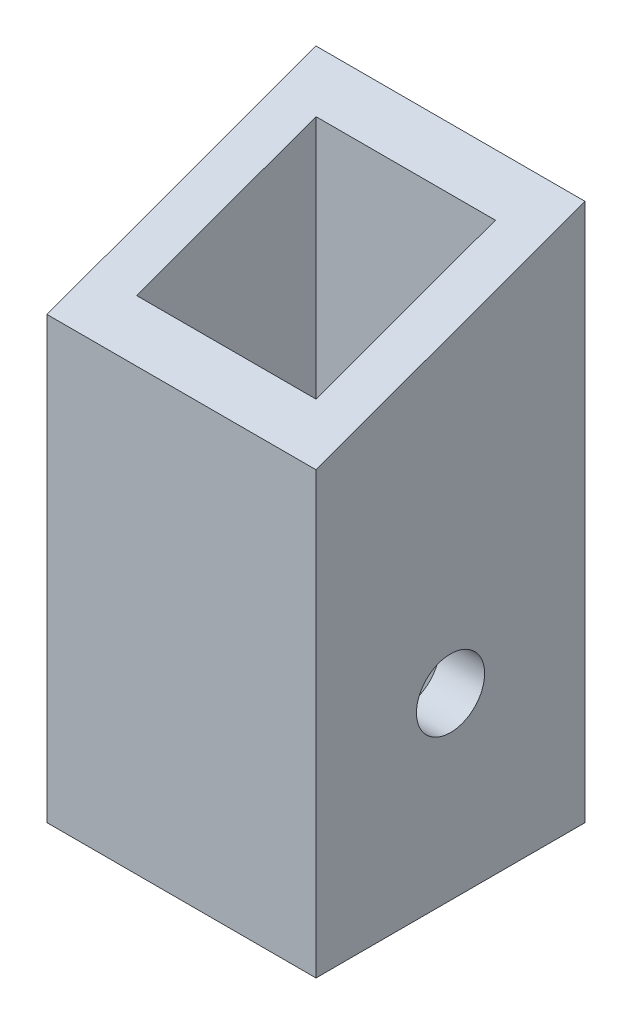
ISO-10303-21;
HEADER;
FILE_DESCRIPTION(('STEP AP214'),'2;1');
FILE_NAME('part.step','',(''),(''),'','','');
FILE_SCHEMA(('AUTOMOTIVE_DESIGN { 1 0 10303 214 1 1 1 1 }'));
ENDSEC;
DATA;
#1=APPLICATION_CONTEXT('core data for automotive mechanical design processes');
#2=APPLICATION_PROTOCOL_DEFINITION('international standard','automotive_design',2000,#1);
#3=PRODUCT_CONTEXT('',#1,'mechanical');
#4=PRODUCT('Part','Part','',(#3));
#5=PRODUCT_RELATED_PRODUCT_CATEGORY('part','',(#4));
#6=PRODUCT_DEFINITION_FORMATION('','',#4);
#7=PRODUCT_DEFINITION_CONTEXT('part definition',#1,'design');
#8=PRODUCT_DEFINITION('design','',#6,#7);
#9=PRODUCT_DEFINITION_SHAPE('','',#8);
#10=(LENGTH_UNIT() NAMED_UNIT(*) SI_UNIT(.MILLI.,.METRE.));
#11=(NAMED_UNIT(*) PLANE_ANGLE_UNIT() SI_UNIT($,.RADIAN.));
#12=(NAMED_UNIT(*) SI_UNIT($,.STERADIAN.) SOLID_ANGLE_UNIT());
#13=UNCERTAINTY_MEASURE_WITH_UNIT(LENGTH_MEASURE(1.E-05),#10,'distance_accuracy_value','');
#14=(GEOMETRIC_REPRESENTATION_CONTEXT(3) GLOBAL_UNCERTAINTY_ASSIGNED_CONTEXT((#13)) GLOBAL_UNIT_ASSIGNED_CONTEXT((#10,
#11,#12)) REPRESENTATION_CONTEXT('',''));
#15=CARTESIAN_POINT('',(0.,0.,0.));
#16=DIRECTION('',(0.,0.,1.));
#17=DIRECTION('',(1.,0.,0.));
#18=AXIS2_PLACEMENT_3D('',#15,#16,#17);
#19=CARTESIAN_POINT('',(19.05,-198.741450370207,-249.444858146427));
#20=DIRECTION('',(0.,-0.93969262078591,-0.342020143325665));
#21=DIRECTION('',(0.,0.342020143325665,-0.93969262078591));
#22=AXIS2_PLACEMENT_3D('',#19,#20,#21);
#23=PLANE('',#22);
#24=DIRECTION('',(1.,0.,0.));
#25=VECTOR('',#24,1.);
#26=CARTESIAN_POINT('',(19.05,-192.963422901231,-265.319858146427));
#27=LINE('',#26,#25);
#28=CARTESIAN_POINT('',(3.175,-192.963422901231,-265.319858146427));
#29=VERTEX_POINT('',#28);
#30=CARTESIAN_POINT('',(15.875,-192.963422901231,-265.319858146427));
#31=VERTEX_POINT('',#30);
#32=EDGE_CURVE('E129',#29,#31,#27,.T.);
#33=ORIENTED_EDGE('',*,*,#32,.T.);
#34=DIRECTION('',(0.,-0.342020143325665,0.93969262078591));
#35=VECTOR('',#34,1.);
#36=CARTESIAN_POINT('',(15.875,-198.741450370207,-249.444858146427));
#37=LINE('',#36,#35);
#38=CARTESIAN_POINT('',(15.875,-197.585844876412,-252.619858146427));
#39=VERTEX_POINT('',#38);
#40=EDGE_CURVE('E132',#31,#39,#37,.T.);
#41=ORIENTED_EDGE('',*,*,#40,.T.);
#42=DIRECTION('',(-1.,0.,0.));
#43=VECTOR('',#42,1.);
#44=CARTESIAN_POINT('',(19.05,-197.585844876412,-252.619858146427));
#45=LINE('',#44,#43);
#46=CARTESIAN_POINT('',(3.175,-197.585844876412,-252.619858146427));
#47=VERTEX_POINT('',#46);
#48=EDGE_CURVE('E124',#39,#47,#45,.T.);
#49=ORIENTED_EDGE('',*,*,#48,.T.);
#50=DIRECTION('',(0.,0.342020143325665,-0.93969262078591));
#51=VECTOR('',#50,1.);
#52=CARTESIAN_POINT('',(3.175,-198.741450370207,-249.444858146427));
#53=LINE('',#52,#51);
#54=EDGE_CURVE('E104',#47,#29,#53,.T.);
#55=ORIENTED_EDGE('',*,*,#54,.T.);
#56=EDGE_LOOP('',(#33,#41,#49,#55));
#57=FACE_BOUND('',#56,.T.);
#58=DIRECTION('',(0.,-0.342020143325665,0.93969262078591));
#59=VECTOR('',#58,1.);
#60=CARTESIAN_POINT('',(0.,-198.741450370207,-249.444858146427));
#61=LINE('',#60,#59);
#62=CARTESIAN_POINT('',(0.,-191.807817407436,-268.494858146427));
#63=VERTEX_POINT('',#62);
#64=CARTESIAN_POINT('',(0.,-198.741450370207,-249.444858146427));
#65=VERTEX_POINT('',#64);
#66=EDGE_CURVE('E135',#63,#65,#61,.T.);
#67=ORIENTED_EDGE('',*,*,#66,.T.);
#68=DIRECTION('',(-1.,0.,0.));
#69=VECTOR('',#68,1.);
#70=CARTESIAN_POINT('',(19.05,-198.741450370207,-249.444858146427));
#71=LINE('',#70,#69);
#72=CARTESIAN_POINT('',(19.05,-198.741450370207,-249.444858146427));
#73=VERTEX_POINT('',#72);
#74=EDGE_CURVE('E11',#73,#65,#71,.T.);
#75=ORIENTED_EDGE('',*,*,#74,.F.);
#76=DIRECTION('',(0.,-0.342020143325665,0.93969262078591));
#77=VECTOR('',#76,1.);
#78=CARTESIAN_POINT('',(19.05,-198.741450370207,-249.444858146427));
#79=LINE('',#78,#77);
#80=CARTESIAN_POINT('',(19.05,-191.807817407436,-268.494858146427));
#81=VERTEX_POINT('',#80);
#82=EDGE_CURVE('E136',#81,#73,#79,.T.);
#83=ORIENTED_EDGE('',*,*,#82,.F.);
#84=DIRECTION('',(-1.,0.,0.));
#85=VECTOR('',#84,1.);
#86=CARTESIAN_POINT('',(19.05,-191.807817407436,-268.494858146427));
#87=LINE('',#86,#85);
#88=EDGE_CURVE('E146',#81,#63,#87,.T.);
#89=ORIENTED_EDGE('',*,*,#88,.T.);
#90=EDGE_LOOP('',(#67,#75,#83,#89));
#91=FACE_BOUND('',#90,.T.);
#92=ADVANCED_FACE('F33',(#57,#91),#23,.F.);
#93=CARTESIAN_POINT('',(19.05,-229.907817407436,-249.444858146427));
#94=DIRECTION('',(0.,0.,-1.));
#95=DIRECTION('',(-1.,0.,0.));
#96=AXIS2_PLACEMENT_3D('',#93,#94,#95);
#97=PLANE('',#96);
#98=DIRECTION('',(0.,-1.,0.));
#99=VECTOR('',#98,1.);
#100=CARTESIAN_POINT('',(0.,-229.907817407436,-249.444858146427));
#101=LINE('',#100,#99);
#102=CARTESIAN_POINT('',(0.,-229.907817407436,-249.444858146427));
#103=VERTEX_POINT('',#102);
#104=EDGE_CURVE('E149',#65,#103,#101,.T.);
#105=ORIENTED_EDGE('',*,*,#104,.T.);
#106=DIRECTION('',(-1.,0.,0.));
#107=VECTOR('',#106,1.);
#108=CARTESIAN_POINT('',(19.05,-229.907817407436,-249.444858146427));
#109=LINE('',#108,#107);
#110=CARTESIAN_POINT('',(19.05,-229.907817407436,-249.444858146427));
#111=VERTEX_POINT('',#110);
#112=EDGE_CURVE('E41',#111,#103,#109,.T.);
#113=ORIENTED_EDGE('',*,*,#112,.F.);
#114=DIRECTION('',(0.,-1.,0.));
#115=VECTOR('',#114,1.);
#116=CARTESIAN_POINT('',(19.05,-229.907817407436,-249.444858146427));
#117=LINE('',#116,#115);
#118=EDGE_CURVE('E139',#73,#111,#117,.T.);
#119=ORIENTED_EDGE('',*,*,#118,.F.);
#120=ORIENTED_EDGE('',*,*,#74,.T.);
#121=EDGE_LOOP('',(#105,#113,#119,#120));
#122=FACE_BOUND('',#121,.T.);
#123=ADVANCED_FACE('F178',(#122),#97,.F.);
#124=CARTESIAN_POINT('',(19.05,-229.907817407436,-268.494858146427));
#125=DIRECTION('',(0.,1.,0.));
#126=DIRECTION('',(0.,0.,1.));
#127=AXIS2_PLACEMENT_3D('',#124,#125,#126);
#128=PLANE('',#127);
#129=DIRECTION('',(-1.,0.,0.));
#130=VECTOR('',#129,1.);
#131=CARTESIAN_POINT('',(3.175,-229.907817407435,-252.619858146427));
#132=LINE('',#131,#130);
#133=CARTESIAN_POINT('',(15.875,-229.907817407436,-252.619858146427));
#134=VERTEX_POINT('',#133);
#135=CARTESIAN_POINT('',(3.175,-229.907817407435,-252.619858146427));
#136=VERTEX_POINT('',#135);
#137=EDGE_CURVE('E110',#134,#136,#132,.T.);
#138=ORIENTED_EDGE('',*,*,#137,.F.);
#139=DIRECTION('',(0.,0.,1.));
#140=VECTOR('',#139,1.);
#141=CARTESIAN_POINT('',(15.875,-229.907817407435,-252.619858146427));
#142=LINE('',#141,#140);
#143=CARTESIAN_POINT('',(15.875,-229.907817407435,-265.319858146427));
#144=VERTEX_POINT('',#143);
#145=EDGE_CURVE('E56',#144,#134,#142,.T.);
#146=ORIENTED_EDGE('',*,*,#145,.F.);
#147=DIRECTION('',(1.,0.,0.));
#148=VECTOR('',#147,1.);
#149=CARTESIAN_POINT('',(3.175,-229.907817407435,-265.319858146427));
#150=LINE('',#149,#148);
#151=CARTESIAN_POINT('',(3.175,-229.907817407435,-265.319858146427));
#152=VERTEX_POINT('',#151);
#153=EDGE_CURVE('E117',#152,#144,#150,.T.);
#154=ORIENTED_EDGE('',*,*,#153,.F.);
#155=DIRECTION('',(0.,0.,-1.));
#156=VECTOR('',#155,1.);
#157=CARTESIAN_POINT('',(3.175,-229.907817407435,-252.619858146427));
#158=LINE('',#157,#156);
#159=EDGE_CURVE('E101',#136,#152,#158,.T.);
#160=ORIENTED_EDGE('',*,*,#159,.F.);
#161=EDGE_LOOP('',(#138,#146,#154,#160));
#162=FACE_BOUND('',#161,.T.);
#163=DIRECTION('',(0.,0.,-1.));
#164=VECTOR('',#163,1.);
#165=CARTESIAN_POINT('',(0.,-229.907817407436,-268.494858146427));
#166=LINE('',#165,#164);
#167=CARTESIAN_POINT('',(0.,-229.907817407436,-268.494858146427));
#168=VERTEX_POINT('',#167);
#169=EDGE_CURVE('E151',#103,#168,#166,.T.);
#170=ORIENTED_EDGE('',*,*,#169,.T.);
#171=DIRECTION('',(-1.,0.,0.));
#172=VECTOR('',#171,1.);
#173=CARTESIAN_POINT('',(19.05,-229.907817407436,-268.494858146427));
#174=LINE('',#173,#172);
#175=CARTESIAN_POINT('',(19.05,-229.907817407436,-268.494858146427));
#176=VERTEX_POINT('',#175);
#177=EDGE_CURVE('E156',#176,#168,#174,.T.);
#178=ORIENTED_EDGE('',*,*,#177,.F.);
#179=DIRECTION('',(0.,0.,-1.));
#180=VECTOR('',#179,1.);
#181=CARTESIAN_POINT('',(19.05,-229.907817407436,-268.494858146427));
#182=LINE('',#181,#180);
#183=EDGE_CURVE('E142',#111,#176,#182,.T.);
#184=ORIENTED_EDGE('',*,*,#183,.F.);
#185=ORIENTED_EDGE('',*,*,#112,.T.);
#186=EDGE_LOOP('',(#170,#178,#184,#185));
#187=FACE_BOUND('',#186,.T.);
#188=ADVANCED_FACE('F114',(#162,#187),#128,.F.);
#189=CARTESIAN_POINT('',(19.05,-191.807817407436,-268.494858146427));
#190=DIRECTION('',(0.,0.,1.));
#191=DIRECTION('',(1.,0.,0.));
#192=AXIS2_PLACEMENT_3D('',#189,#190,#191);
#193=PLANE('',#192);
#194=DIRECTION('',(0.,1.,0.));
#195=VECTOR('',#194,1.);
#196=CARTESIAN_POINT('',(0.,-191.807817407436,-268.494858146427));
#197=LINE('',#196,#195);
#198=EDGE_CURVE('E140',#168,#63,#197,.T.);
#199=ORIENTED_EDGE('',*,*,#198,.T.);
#200=ORIENTED_EDGE('',*,*,#88,.F.);
#201=DIRECTION('',(0.,1.,0.));
#202=VECTOR('',#201,1.);
#203=CARTESIAN_POINT('',(19.05,-191.807817407436,-268.494858146427));
#204=LINE('',#203,#202);
#205=EDGE_CURVE('E144',#176,#81,#204,.T.);
#206=ORIENTED_EDGE('',*,*,#205,.F.);
#207=ORIENTED_EDGE('',*,*,#177,.T.);
#208=EDGE_LOOP('',(#199,#200,#206,#207));
#209=FACE_BOUND('',#208,.T.);
#210=ADVANCED_FACE('F171',(#209),#193,.F.);
#211=CARTESIAN_POINT('',(19.05,0.,0.));
#212=DIRECTION('',(-1.,0.,0.));
#213=DIRECTION('',(0.,0.,1.));
#214=AXIS2_PLACEMENT_3D('',#211,#212,#213);
#215=PLANE('',#214);
#216=CARTESIAN_POINT('',(19.05,-217.207817407436,-258.969858146427));
#217=DIRECTION('',(1.,0.,0.));
#218=DIRECTION('',(0.,0.,-1.));
#219=AXIS2_PLACEMENT_3D('',#216,#217,#218);
#220=CIRCLE('',#219,2.413);
#221=CARTESIAN_POINT('',(19.05,-217.207817407436,-261.382858146427));
#222=VERTEX_POINT('',#221);
#223=EDGE_CURVE('E219',#222,#222,#220,.T.);
#224=ORIENTED_EDGE('',*,*,#223,.F.);
#225=EDGE_LOOP('',(#224));
#226=FACE_BOUND('',#225,.T.);
#227=ORIENTED_EDGE('',*,*,#82,.T.);
#228=ORIENTED_EDGE('',*,*,#118,.T.);
#229=ORIENTED_EDGE('',*,*,#183,.T.);
#230=ORIENTED_EDGE('',*,*,#205,.T.);
#231=EDGE_LOOP('',(#227,#228,#229,#230));
#232=FACE_BOUND('',#231,.T.);
#233=ADVANCED_FACE('F177',(#226,#232),#215,.F.);
#234=CARTESIAN_POINT('',(0.,0.,0.));
#235=DIRECTION('',(-1.,0.,0.));
#236=DIRECTION('',(0.,0.,1.));
#237=AXIS2_PLACEMENT_3D('',#234,#235,#236);
#238=PLANE('',#237);
#239=CARTESIAN_POINT('',(0.,-217.207817407436,-258.969858146427));
#240=DIRECTION('',(1.,0.,0.));
#241=DIRECTION('',(0.,0.,-1.));
#242=AXIS2_PLACEMENT_3D('',#239,#240,#241);
#243=CIRCLE('',#242,2.413);
#244=CARTESIAN_POINT('',(0.,-217.207817407436,-261.382858146427));
#245=VERTEX_POINT('',#244);
#246=EDGE_CURVE('E225',#245,#245,#243,.T.);
#247=ORIENTED_EDGE('',*,*,#246,.T.);
#248=EDGE_LOOP('',(#247));
#249=FACE_BOUND('',#248,.T.);
#250=ORIENTED_EDGE('',*,*,#66,.F.);
#251=ORIENTED_EDGE('',*,*,#198,.F.);
#252=ORIENTED_EDGE('',*,*,#169,.F.);
#253=ORIENTED_EDGE('',*,*,#104,.F.);
#254=EDGE_LOOP('',(#250,#251,#252,#253));
#255=FACE_BOUND('',#254,.T.);
#256=ADVANCED_FACE('F168',(#249,#255),#238,.T.);
#257=CARTESIAN_POINT('',(15.875,-191.807817407436,-252.619858146427));
#258=DIRECTION('',(1.,0.,0.));
#259=DIRECTION('',(0.,0.,-1.));
#260=AXIS2_PLACEMENT_3D('',#257,#258,#259);
#261=PLANE('',#260);
#262=CARTESIAN_POINT('',(15.875,-217.207817407436,-258.969858146427));
#263=DIRECTION('',(1.,0.,0.));
#264=DIRECTION('',(0.,0.,-1.));
#265=AXIS2_PLACEMENT_3D('',#262,#263,#264);
#266=CIRCLE('',#265,2.413);
#267=CARTESIAN_POINT('',(15.875,-217.207817407436,-261.382858146427));
#268=VERTEX_POINT('',#267);
#269=EDGE_CURVE('E222',#268,#268,#266,.T.);
#270=ORIENTED_EDGE('',*,*,#269,.T.);
#271=EDGE_LOOP('',(#270));
#272=FACE_BOUND('',#271,.T.);
#273=DIRECTION('',(0.,-1.,0.));
#274=VECTOR('',#273,1.);
#275=CARTESIAN_POINT('',(15.875,-191.807817407436,-265.319858146427));
#276=LINE('',#275,#274);
#277=EDGE_CURVE('E122',#31,#144,#276,.T.);
#278=ORIENTED_EDGE('',*,*,#277,.T.);
#279=ORIENTED_EDGE('',*,*,#145,.T.);
#280=DIRECTION('',(0.,-1.,0.));
#281=VECTOR('',#280,1.);
#282=CARTESIAN_POINT('',(15.875,-191.807817407436,-252.619858146427));
#283=LINE('',#282,#281);
#284=EDGE_CURVE('E107',#39,#134,#283,.T.);
#285=ORIENTED_EDGE('',*,*,#284,.F.);
#286=ORIENTED_EDGE('',*,*,#40,.F.);
#287=EDGE_LOOP('',(#278,#279,#285,#286));
#288=FACE_BOUND('',#287,.T.);
#289=ADVANCED_FACE('F191',(#272,#288),#261,.F.);
#290=CARTESIAN_POINT('',(3.175,-191.807817407436,-265.319858146427));
#291=DIRECTION('',(0.,0.,-1.));
#292=DIRECTION('',(-1.,0.,0.));
#293=AXIS2_PLACEMENT_3D('',#290,#291,#292);
#294=PLANE('',#293);
#295=DIRECTION('',(0.,-1.,0.));
#296=VECTOR('',#295,1.);
#297=CARTESIAN_POINT('',(3.175,-191.807817407436,-265.319858146427));
#298=LINE('',#297,#296);
#299=EDGE_CURVE('E106',#29,#152,#298,.T.);
#300=ORIENTED_EDGE('',*,*,#299,.T.);
#301=ORIENTED_EDGE('',*,*,#153,.T.);
#302=ORIENTED_EDGE('',*,*,#277,.F.);
#303=ORIENTED_EDGE('',*,*,#32,.F.);
#304=EDGE_LOOP('',(#300,#301,#302,#303));
#305=FACE_BOUND('',#304,.T.);
#306=ADVANCED_FACE('F198',(#305),#294,.F.);
#307=CARTESIAN_POINT('',(3.175,-191.807817407436,-252.619858146427));
#308=DIRECTION('',(-1.,0.,0.));
#309=DIRECTION('',(0.,0.,1.));
#310=AXIS2_PLACEMENT_3D('',#307,#308,#309);
#311=PLANE('',#310);
#312=CARTESIAN_POINT('',(3.175,-217.207817407436,-258.969858146427));
#313=DIRECTION('',(-1.,0.,0.));
#314=DIRECTION('',(0.,0.,1.));
#315=AXIS2_PLACEMENT_3D('',#312,#313,#314);
#316=CIRCLE('',#315,2.413);
#317=CARTESIAN_POINT('',(3.175,-217.207817407436,-261.382858146427));
#318=VERTEX_POINT('',#317);
#319=EDGE_CURVE('E36',#318,#318,#316,.T.);
#320=ORIENTED_EDGE('',*,*,#319,.T.);
#321=EDGE_LOOP('',(#320));
#322=FACE_BOUND('',#321,.T.);
#323=DIRECTION('',(0.,-1.,0.));
#324=VECTOR('',#323,1.);
#325=CARTESIAN_POINT('',(3.175,-191.807817407436,-252.619858146427));
#326=LINE('',#325,#324);
#327=EDGE_CURVE('E48',#47,#136,#326,.T.);
#328=ORIENTED_EDGE('',*,*,#327,.T.);
#329=ORIENTED_EDGE('',*,*,#159,.T.);
#330=ORIENTED_EDGE('',*,*,#299,.F.);
#331=ORIENTED_EDGE('',*,*,#54,.F.);
#332=EDGE_LOOP('',(#328,#329,#330,#331));
#333=FACE_BOUND('',#332,.T.);
#334=ADVANCED_FACE('F98',(#322,#333),#311,.F.);
#335=CARTESIAN_POINT('',(3.175,-191.807817407436,-252.619858146427));
#336=DIRECTION('',(0.,0.,1.));
#337=DIRECTION('',(1.,0.,0.));
#338=AXIS2_PLACEMENT_3D('',#335,#336,#337);
#339=PLANE('',#338);
#340=ORIENTED_EDGE('',*,*,#284,.T.);
#341=ORIENTED_EDGE('',*,*,#137,.T.);
#342=ORIENTED_EDGE('',*,*,#327,.F.);
#343=ORIENTED_EDGE('',*,*,#48,.F.);
#344=EDGE_LOOP('',(#340,#341,#342,#343));
#345=FACE_BOUND('',#344,.T.);
#346=ADVANCED_FACE('F111',(#345),#339,.F.);
#347=CARTESIAN_POINT('',(0.,-217.207817407436,-258.969858146427));
#348=DIRECTION('',(1.,0.,0.));
#349=DIRECTION('',(0.,0.,-1.));
#350=AXIS2_PLACEMENT_3D('',#347,#348,#349);
#351=CYLINDRICAL_SURFACE('',#350,2.413);
#352=CARTESIAN_POINT('',(0.,-217.207817407436,-261.382858146427));
#353=CARTESIAN_POINT('',(0.0330729166666667,-217.207817407436,-261.382858146427));
#354=CARTESIAN_POINT('',(0.0661458333333334,-217.207817407436,-261.382858146427));
#355=CARTESIAN_POINT('',(0.132291666666667,-217.207817407436,-261.382858146427));
#356=CARTESIAN_POINT('',(0.165364583333333,-217.207817407436,-261.382858146427));
#357=CARTESIAN_POINT('',(0.231510416666667,-217.207817407436,-261.382858146427));
#358=CARTESIAN_POINT('',(0.264583333333333,-217.207817407436,-261.382858146427));
#359=CARTESIAN_POINT('',(0.330729166666667,-217.207817407436,-261.382858146427));
#360=CARTESIAN_POINT('',(0.363802083333333,-217.207817407436,-261.382858146427));
#361=CARTESIAN_POINT('',(0.429947916666667,-217.207817407436,-261.382858146427));
#362=CARTESIAN_POINT('',(0.463020833333333,-217.207817407436,-261.382858146427));
#363=CARTESIAN_POINT('',(0.529166666666667,-217.207817407436,-261.382858146427));
#364=CARTESIAN_POINT('',(0.562239583333334,-217.207817407436,-261.382858146427));
#365=CARTESIAN_POINT('',(0.628385416666667,-217.207817407436,-261.382858146427));
#366=CARTESIAN_POINT('',(0.661458333333334,-217.207817407436,-261.382858146427));
#367=CARTESIAN_POINT('',(0.727604166666667,-217.207817407436,-261.382858146427));
#368=CARTESIAN_POINT('',(0.760677083333334,-217.207817407436,-261.382858146427));
#369=CARTESIAN_POINT('',(0.826822916666667,-217.207817407436,-261.382858146427));
#370=CARTESIAN_POINT('',(0.859895833333334,-217.207817407436,-261.382858146427));
#371=CARTESIAN_POINT('',(0.926041666666667,-217.207817407436,-261.382858146427));
#372=CARTESIAN_POINT('',(0.959114583333334,-217.207817407436,-261.382858146427));
#373=CARTESIAN_POINT('',(1.02526041666667,-217.207817407436,-261.382858146427));
#374=CARTESIAN_POINT('',(1.05833333333333,-217.207817407436,-261.382858146427));
#375=CARTESIAN_POINT('',(1.12447916666667,-217.207817407436,-261.382858146427));
#376=CARTESIAN_POINT('',(1.15755208333333,-217.207817407436,-261.382858146427));
#377=CARTESIAN_POINT('',(1.22369791666667,-217.207817407436,-261.382858146427));
#378=CARTESIAN_POINT('',(1.25677083333333,-217.207817407436,-261.382858146427));
#379=CARTESIAN_POINT('',(1.32291666666667,-217.207817407436,-261.382858146427));
#380=CARTESIAN_POINT('',(1.35598958333333,-217.207817407436,-261.382858146427));
#381=CARTESIAN_POINT('',(1.42213541666667,-217.207817407436,-261.382858146427));
#382=CARTESIAN_POINT('',(1.45520833333333,-217.207817407436,-261.382858146427));
#383=CARTESIAN_POINT('',(1.52135416666667,-217.207817407436,-261.382858146427));
#384=CARTESIAN_POINT('',(1.55442708333333,-217.207817407436,-261.382858146427));
#385=CARTESIAN_POINT('',(1.62057291666667,-217.207817407436,-261.382858146427));
#386=CARTESIAN_POINT('',(1.65364583333333,-217.207817407436,-261.382858146427));
#387=CARTESIAN_POINT('',(1.71979166666667,-217.207817407436,-261.382858146427));
#388=CARTESIAN_POINT('',(1.75286458333333,-217.207817407436,-261.382858146427));
#389=CARTESIAN_POINT('',(1.81901041666667,-217.207817407436,-261.382858146427));
#390=CARTESIAN_POINT('',(1.85208333333333,-217.207817407436,-261.382858146427));
#391=CARTESIAN_POINT('',(1.91822916666667,-217.207817407436,-261.382858146427));
#392=CARTESIAN_POINT('',(1.95130208333333,-217.207817407436,-261.382858146427));
#393=CARTESIAN_POINT('',(2.01744791666667,-217.207817407436,-261.382858146427));
#394=CARTESIAN_POINT('',(2.05052083333333,-217.207817407436,-261.382858146427));
#395=CARTESIAN_POINT('',(2.11666666666667,-217.207817407436,-261.382858146427));
#396=CARTESIAN_POINT('',(2.14973958333333,-217.207817407436,-261.382858146427));
#397=CARTESIAN_POINT('',(2.21588541666667,-217.207817407436,-261.382858146427));
#398=CARTESIAN_POINT('',(2.24895833333333,-217.207817407436,-261.382858146427));
#399=CARTESIAN_POINT('',(2.31510416666667,-217.207817407436,-261.382858146427));
#400=CARTESIAN_POINT('',(2.34817708333333,-217.207817407436,-261.382858146427));
#401=CARTESIAN_POINT('',(2.41432291666667,-217.207817407436,-261.382858146427));
#402=CARTESIAN_POINT('',(2.44739583333333,-217.207817407436,-261.382858146427));
#403=CARTESIAN_POINT('',(2.51354166666667,-217.207817407436,-261.382858146427));
#404=CARTESIAN_POINT('',(2.54661458333333,-217.207817407436,-261.382858146427));
#405=CARTESIAN_POINT('',(2.61276041666667,-217.207817407436,-261.382858146427));
#406=CARTESIAN_POINT('',(2.64583333333333,-217.207817407436,-261.382858146427));
#407=CARTESIAN_POINT('',(2.71197916666667,-217.207817407436,-261.382858146427));
#408=CARTESIAN_POINT('',(2.74505208333333,-217.207817407436,-261.382858146427));
#409=CARTESIAN_POINT('',(2.81119791666667,-217.207817407436,-261.382858146427));
#410=CARTESIAN_POINT('',(2.84427083333333,-217.207817407436,-261.382858146427));
#411=CARTESIAN_POINT('',(2.91041666666667,-217.207817407436,-261.382858146427));
#412=CARTESIAN_POINT('',(2.94348958333333,-217.207817407436,-261.382858146427));
#413=CARTESIAN_POINT('',(3.00963541666667,-217.207817407436,-261.382858146427));
#414=CARTESIAN_POINT('',(3.04270833333333,-217.207817407436,-261.382858146427));
#415=CARTESIAN_POINT('',(3.10885416666667,-217.207817407436,-261.382858146427));
#416=CARTESIAN_POINT('',(3.14192708333333,-217.207817407436,-261.382858146427));
#417=CARTESIAN_POINT('',(3.175,-217.207817407436,-261.382858146427));
#418=B_SPLINE_CURVE_WITH_KNOTS('',3,(#352,#353,#354,#355,#356,#357,#358,#359,#360,#361,#362,
#363,#364,#365,#366,#367,#368,#369,#370,#371,#372,#373,#374,#375,#376,#377,#378,#379,#380,#381,
#382,#383,#384,#385,#386,#387,#388,#389,#390,#391,#392,#393,#394,#395,#396,#397,#398,#399,#400,
#401,#402,#403,#404,#405,#406,#407,#408,#409,#410,#411,#412,#413,#414,#415,#416,#417),
.UNSPECIFIED.,.F.,.F.,(4,2,2,2,2,2,2,2,2,2,2,2,2,2,2,2,2,2,2,2,2,2,2,2,2,2,2,2,2,2,2,2,4),(0.,
0.09921875,0.1984375,0.29765625,0.396875,0.49609375,0.5953125,0.69453125,0.79375,0.89296875,
0.9921875,1.09140625,1.190625,1.28984375,1.3890625,1.48828125,1.5875,1.68671875,1.7859375,
1.88515625,1.984375,2.08359375,2.1828125,2.28203125,2.38125,2.48046875,2.5796875,2.67890625,
2.778125,2.87734375,2.9765625,3.07578125,3.175),.UNSPECIFIED.);
#419=EDGE_CURVE('BSEAM202',#245,#318,#418,.T.);
#420=ORIENTED_EDGE('',*,*,#246,.F.);
#421=ORIENTED_EDGE('',*,*,#319,.F.);
#422=ORIENTED_EDGE('',*,*,#419,.T.);
#423=ORIENTED_EDGE('',*,*,#419,.F.);
#424=EDGE_LOOP('',(#420,#422,#421,#423));
#425=FACE_BOUND('',#424,.T.);
#426=ADVANCED_FACE('F202',(#425),#351,.F.);
#427=CARTESIAN_POINT('',(19.05,-217.207817407436,-261.382858146427));
#428=CARTESIAN_POINT('',(19.0169270833333,-217.207817407436,-261.382858146427));
#429=CARTESIAN_POINT('',(18.9838541666667,-217.207817407436,-261.382858146427));
#430=CARTESIAN_POINT('',(18.9177083333333,-217.207817407436,-261.382858146427));
#431=CARTESIAN_POINT('',(18.8846354166667,-217.207817407436,-261.382858146427));
#432=CARTESIAN_POINT('',(18.8184895833333,-217.207817407436,-261.382858146427));
#433=CARTESIAN_POINT('',(18.7854166666667,-217.207817407436,-261.382858146427));
#434=CARTESIAN_POINT('',(18.7192708333333,-217.207817407436,-261.382858146427));
#435=CARTESIAN_POINT('',(18.6861979166667,-217.207817407436,-261.382858146427));
#436=CARTESIAN_POINT('',(18.6200520833333,-217.207817407436,-261.382858146427));
#437=CARTESIAN_POINT('',(18.5869791666667,-217.207817407436,-261.382858146427));
#438=CARTESIAN_POINT('',(18.5208333333333,-217.207817407436,-261.382858146427));
#439=CARTESIAN_POINT('',(18.4877604166667,-217.207817407436,-261.382858146427));
#440=CARTESIAN_POINT('',(18.4216145833333,-217.207817407436,-261.382858146427));
#441=CARTESIAN_POINT('',(18.3885416666667,-217.207817407436,-261.382858146427));
#442=CARTESIAN_POINT('',(18.3223958333333,-217.207817407436,-261.382858146427));
#443=CARTESIAN_POINT('',(18.2893229166667,-217.207817407436,-261.382858146427));
#444=CARTESIAN_POINT('',(18.2231770833333,-217.207817407436,-261.382858146427));
#445=CARTESIAN_POINT('',(18.1901041666667,-217.207817407436,-261.382858146427));
#446=CARTESIAN_POINT('',(18.1239583333333,-217.207817407436,-261.382858146427));
#447=CARTESIAN_POINT('',(18.0908854166667,-217.207817407436,-261.382858146427));
#448=CARTESIAN_POINT('',(18.0247395833333,-217.207817407436,-261.382858146427));
#449=CARTESIAN_POINT('',(17.9916666666667,-217.207817407436,-261.382858146427));
#450=CARTESIAN_POINT('',(17.9255208333333,-217.207817407436,-261.382858146427));
#451=CARTESIAN_POINT('',(17.8924479166667,-217.207817407436,-261.382858146427));
#452=CARTESIAN_POINT('',(17.8263020833333,-217.207817407436,-261.382858146427));
#453=CARTESIAN_POINT('',(17.7932291666667,-217.207817407436,-261.382858146427));
#454=CARTESIAN_POINT('',(17.7270833333333,-217.207817407436,-261.382858146427));
#455=CARTESIAN_POINT('',(17.6940104166667,-217.207817407436,-261.382858146427));
#456=CARTESIAN_POINT('',(17.6278645833333,-217.207817407436,-261.382858146427));
#457=CARTESIAN_POINT('',(17.5947916666667,-217.207817407436,-261.382858146427));
#458=CARTESIAN_POINT('',(17.5286458333333,-217.207817407436,-261.382858146427));
#459=CARTESIAN_POINT('',(17.4955729166667,-217.207817407436,-261.382858146427));
#460=CARTESIAN_POINT('',(17.4294270833333,-217.207817407436,-261.382858146427));
#461=CARTESIAN_POINT('',(17.3963541666667,-217.207817407436,-261.382858146427));
#462=CARTESIAN_POINT('',(17.3302083333333,-217.207817407436,-261.382858146427));
#463=CARTESIAN_POINT('',(17.2971354166667,-217.207817407436,-261.382858146427));
#464=CARTESIAN_POINT('',(17.2309895833333,-217.207817407436,-261.382858146427));
#465=CARTESIAN_POINT('',(17.1979166666667,-217.207817407436,-261.382858146427));
#466=CARTESIAN_POINT('',(17.1317708333333,-217.207817407436,-261.382858146427));
#467=CARTESIAN_POINT('',(17.0986979166667,-217.207817407436,-261.382858146427));
#468=CARTESIAN_POINT('',(17.0325520833333,-217.207817407436,-261.382858146427));
#469=CARTESIAN_POINT('',(16.9994791666667,-217.207817407436,-261.382858146427));
#470=CARTESIAN_POINT('',(16.9333333333333,-217.207817407436,-261.382858146427));
#471=CARTESIAN_POINT('',(16.9002604166667,-217.207817407436,-261.382858146427));
#472=CARTESIAN_POINT('',(16.8341145833333,-217.207817407436,-261.382858146427));
#473=CARTESIAN_POINT('',(16.8010416666667,-217.207817407436,-261.382858146427));
#474=CARTESIAN_POINT('',(16.7348958333333,-217.207817407436,-261.382858146427));
#475=CARTESIAN_POINT('',(16.7018229166667,-217.207817407436,-261.382858146427));
#476=CARTESIAN_POINT('',(16.6356770833333,-217.207817407436,-261.382858146427));
#477=CARTESIAN_POINT('',(16.6026041666667,-217.207817407436,-261.382858146427));
#478=CARTESIAN_POINT('',(16.5364583333333,-217.207817407436,-261.382858146427));
#479=CARTESIAN_POINT('',(16.5033854166667,-217.207817407436,-261.382858146427));
#480=CARTESIAN_POINT('',(16.4372395833333,-217.207817407436,-261.382858146427));
#481=CARTESIAN_POINT('',(16.4041666666667,-217.207817407436,-261.382858146427));
#482=CARTESIAN_POINT('',(16.3380208333333,-217.207817407436,-261.382858146427));
#483=CARTESIAN_POINT('',(16.3049479166667,-217.207817407436,-261.382858146427));
#484=CARTESIAN_POINT('',(16.2388020833333,-217.207817407436,-261.382858146427));
#485=CARTESIAN_POINT('',(16.2057291666667,-217.207817407436,-261.382858146427));
#486=CARTESIAN_POINT('',(16.1395833333333,-217.207817407436,-261.382858146427));
#487=CARTESIAN_POINT('',(16.1065104166667,-217.207817407436,-261.382858146427));
#488=CARTESIAN_POINT('',(16.0403645833333,-217.207817407436,-261.382858146427));
#489=CARTESIAN_POINT('',(16.0072916666667,-217.207817407436,-261.382858146427));
#490=CARTESIAN_POINT('',(15.9411458333333,-217.207817407436,-261.382858146427));
#491=CARTESIAN_POINT('',(15.9080729166667,-217.207817407436,-261.382858146427));
#492=CARTESIAN_POINT('',(15.875,-217.207817407436,-261.382858146427));
#493=B_SPLINE_CURVE_WITH_KNOTS('',3,(#427,#428,#429,#430,#431,#432,#433,#434,#435,#436,#437,
#438,#439,#440,#441,#442,#443,#444,#445,#446,#447,#448,#449,#450,#451,#452,#453,#454,#455,#456,
#457,#458,#459,#460,#461,#462,#463,#464,#465,#466,#467,#468,#469,#470,#471,#472,#473,#474,#475,
#476,#477,#478,#479,#480,#481,#482,#483,#484,#485,#486,#487,#488,#489,#490,#491,#492),
.UNSPECIFIED.,.F.,.F.,(4,2,2,2,2,2,2,2,2,2,2,2,2,2,2,2,2,2,2,2,2,2,2,2,2,2,2,2,2,2,2,2,4),(0.,
0.0992187500000012,0.198437499999999,0.29765625,0.396875000000001,0.496093749999999,0.5953125,
0.694531250000002,0.793750000000003,0.892968750000001,0.992187500000002,1.09140625,1.190625,
1.28984375,1.3890625,1.48828125,1.5875,1.68671875,1.7859375,1.88515625,1.984375,2.08359375,
2.1828125,2.28203125,2.38125,2.48046875,2.5796875,2.67890625,2.778125,2.87734375,
2.97656250000001,3.07578125,3.175),.UNSPECIFIED.);
#494=EDGE_CURVE('BSEAM209',#222,#268,#493,.T.);
#495=ORIENTED_EDGE('',*,*,#223,.T.);
#496=ORIENTED_EDGE('',*,*,#269,.F.);
#497=ORIENTED_EDGE('',*,*,#494,.T.);
#498=ORIENTED_EDGE('',*,*,#494,.F.);
#499=EDGE_LOOP('',(#495,#497,#496,#498));
#500=FACE_BOUND('',#499,.T.);
#501=ADVANCED_FACE('F209',(#500),#351,.F.);
#502=CLOSED_SHELL('',(#92,#123,#188,#210,#233,#256,#289,#306,#334,#346,#426,#501));
#503=MANIFOLD_SOLID_BREP('B2',#502);
#504=ADVANCED_BREP_SHAPE_REPRESENTATION('',(#18,#503),#14);
#505=SHAPE_DEFINITION_REPRESENTATION(#9,#504);
ENDSEC;
END-ISO-10303-21;
